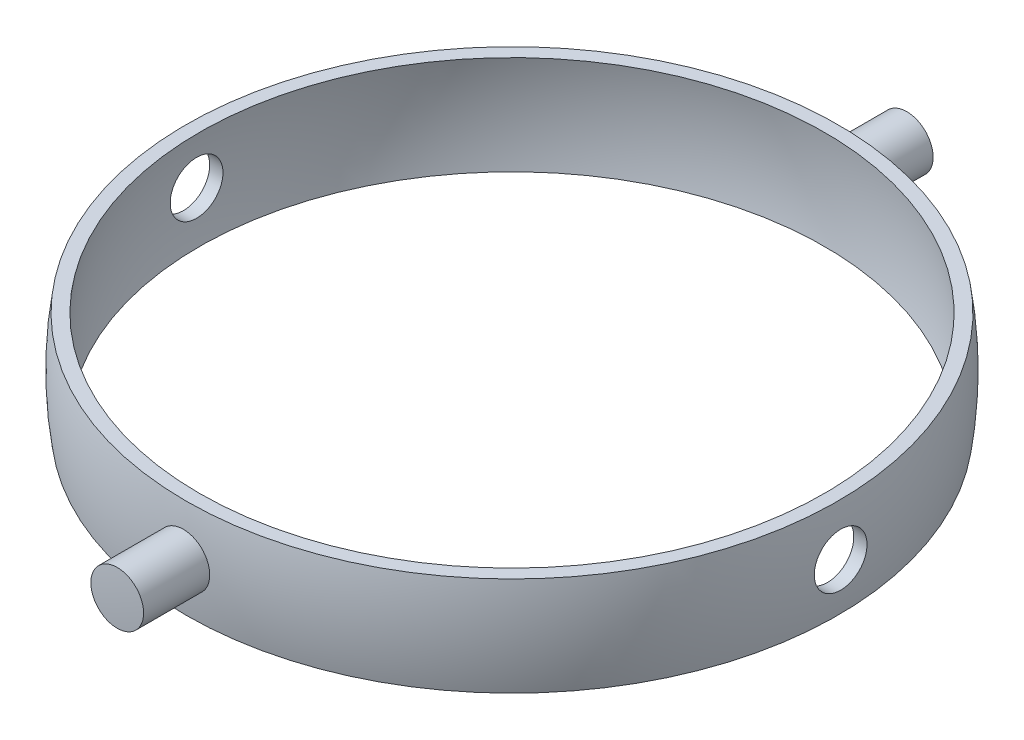
ISO-10303-21;
HEADER;
FILE_DESCRIPTION(('STEP AP214'),'2;1');
FILE_NAME('part.step','',(''),(''),'','','');
FILE_SCHEMA(('AUTOMOTIVE_DESIGN { 1 0 10303 214 1 1 1 1 }'));
ENDSEC;
DATA;
#1=APPLICATION_CONTEXT('core data for automotive mechanical design processes');
#2=APPLICATION_PROTOCOL_DEFINITION('international standard','automotive_design',2000,#1);
#3=PRODUCT_CONTEXT('',#1,'mechanical');
#4=PRODUCT('Part','Part','',(#3));
#5=PRODUCT_RELATED_PRODUCT_CATEGORY('part','',(#4));
#6=PRODUCT_DEFINITION_FORMATION('','',#4);
#7=PRODUCT_DEFINITION_CONTEXT('part definition',#1,'design');
#8=PRODUCT_DEFINITION('design','',#6,#7);
#9=PRODUCT_DEFINITION_SHAPE('','',#8);
#10=(LENGTH_UNIT() NAMED_UNIT(*) SI_UNIT(.MILLI.,.METRE.));
#11=(NAMED_UNIT(*) PLANE_ANGLE_UNIT() SI_UNIT($,.RADIAN.));
#12=(NAMED_UNIT(*) SI_UNIT($,.STERADIAN.) SOLID_ANGLE_UNIT());
#13=UNCERTAINTY_MEASURE_WITH_UNIT(LENGTH_MEASURE(1.E-05),#10,'distance_accuracy_value','');
#14=(GEOMETRIC_REPRESENTATION_CONTEXT(3) GLOBAL_UNCERTAINTY_ASSIGNED_CONTEXT((#13)) GLOBAL_UNIT_ASSIGNED_CONTEXT((#10,
#11,#12)) REPRESENTATION_CONTEXT('',''));
#15=CARTESIAN_POINT('',(0.,0.,0.));
#16=DIRECTION('',(0.,0.,1.));
#17=DIRECTION('',(1.,0.,0.));
#18=AXIS2_PLACEMENT_3D('',#15,#16,#17);
#19=CARTESIAN_POINT('',(0.,0.,0.));
#20=DIRECTION('',(0.,1.,0.));
#21=DIRECTION('',(-1.,0.,0.));
#22=AXIS2_PLACEMENT_3D('',#19,#20,#21);
#23=SPHERICAL_SURFACE('',#22,50.);
#24=CARTESIAN_POINT('',(0.,7.49999999999999,0.));
#25=DIRECTION('',(0.,1.,0.));
#26=DIRECTION('',(0.,0.,1.));
#27=AXIS2_PLACEMENT_3D('',#24,#25,#26);
#28=CIRCLE('',#27,49.434299833213);
#29=CARTESIAN_POINT('',(0.,7.49999999999999,49.434299833213));
#30=VERTEX_POINT('',#29);
#31=EDGE_CURVE('E81',#30,#30,#28,.T.);
#32=ORIENTED_EDGE('',*,*,#31,.F.);
#33=EDGE_LOOP('',(#32));
#34=FACE_BOUND('',#33,.T.);
#35=CARTESIAN_POINT('',(0.,-7.50000000000001,0.));
#36=DIRECTION('',(0.,1.,0.));
#37=DIRECTION('',(0.,0.,1.));
#38=AXIS2_PLACEMENT_3D('',#35,#36,#37);
#39=CIRCLE('',#38,49.434299833213);
#40=CARTESIAN_POINT('',(0.,-7.50000000000001,49.434299833213));
#41=VERTEX_POINT('',#40);
#42=EDGE_CURVE('E47',#41,#41,#39,.T.);
#43=ORIENTED_EDGE('',*,*,#42,.T.);
#44=EDGE_LOOP('',(#43));
#45=FACE_BOUND('',#44,.T.);
#46=CARTESIAN_POINT('',(-49.8397431775085,0.,0.));
#47=DIRECTION('',(1.,0.,0.));
#48=DIRECTION('',(0.,0.,-1.));
#49=AXIS2_PLACEMENT_3D('',#46,#47,#48);
#50=CIRCLE('',#49,4.);
#51=CARTESIAN_POINT('',(-49.8397431775085,0.,-4.));
#52=VERTEX_POINT('',#51);
#53=EDGE_CURVE('E72',#52,#52,#50,.F.);
#54=ORIENTED_EDGE('',*,*,#53,.F.);
#55=EDGE_LOOP('',(#54));
#56=FACE_BOUND('',#55,.T.);
#57=CARTESIAN_POINT('',(49.8397431775085,0.,0.));
#58=DIRECTION('',(-1.,0.,0.));
#59=DIRECTION('',(0.,0.,1.));
#60=AXIS2_PLACEMENT_3D('',#57,#58,#59);
#61=CIRCLE('',#60,4.);
#62=CARTESIAN_POINT('',(49.8397431775085,0.,4.));
#63=VERTEX_POINT('',#62);
#64=EDGE_CURVE('E76',#63,#63,#61,.F.);
#65=ORIENTED_EDGE('',*,*,#64,.F.);
#66=EDGE_LOOP('',(#65));
#67=FACE_BOUND('',#66,.T.);
#68=CARTESIAN_POINT('',(0.,0.,49.8397431775084));
#69=DIRECTION('',(0.,0.,-1.));
#70=DIRECTION('',(-1.,0.,0.));
#71=AXIS2_PLACEMENT_3D('',#68,#69,#70);
#72=CIRCLE('',#71,4.);
#73=CARTESIAN_POINT('',(4.,0.,49.8397431775084));
#74=VERTEX_POINT('',#73);
#75=EDGE_CURVE('E11',#74,#74,#72,.F.);
#76=ORIENTED_EDGE('',*,*,#75,.F.);
#77=EDGE_LOOP('',(#76));
#78=FACE_BOUND('',#77,.T.);
#79=CARTESIAN_POINT('',(0.,0.,-49.8397431775085));
#80=DIRECTION('',(0.,0.,1.));
#81=DIRECTION('',(1.,0.,0.));
#82=AXIS2_PLACEMENT_3D('',#79,#80,#81);
#83=CIRCLE('',#82,4.);
#84=CARTESIAN_POINT('',(4.,0.,-49.8397431775085));
#85=VERTEX_POINT('',#84);
#86=EDGE_CURVE('E63',#85,#85,#83,.F.);
#87=ORIENTED_EDGE('',*,*,#86,.F.);
#88=EDGE_LOOP('',(#87));
#89=FACE_BOUND('',#88,.T.);
#90=ADVANCED_FACE('F38',(#34,#45,#56,#67,#78,#89),#23,.T.);
#91=CARTESIAN_POINT('',(-49.434299833213,-7.5,0.));
#92=DIRECTION('',(0.,-1.,0.));
#93=DIRECTION('',(0.,0.,-1.));
#94=AXIS2_PLACEMENT_3D('',#91,#92,#93);
#95=PLANE('',#94);
#96=CARTESIAN_POINT('',(0.,-7.49999999999999,0.));
#97=DIRECTION('',(0.,1.,0.));
#98=DIRECTION('',(0.,0.,1.));
#99=AXIS2_PLACEMENT_3D('',#96,#97,#98);
#100=CIRCLE('',#99,47.4104418878373);
#101=CARTESIAN_POINT('',(0.,-7.49999999999999,47.4104418878373));
#102=VERTEX_POINT('',#101);
#103=EDGE_CURVE('E89',#102,#102,#100,.T.);
#104=ORIENTED_EDGE('',*,*,#103,.T.);
#105=EDGE_LOOP('',(#104));
#106=FACE_BOUND('',#105,.T.);
#107=ORIENTED_EDGE('',*,*,#42,.F.);
#108=EDGE_LOOP('',(#107));
#109=FACE_BOUND('',#108,.T.);
#110=ADVANCED_FACE('F109',(#106,#109),#95,.T.);
#111=CARTESIAN_POINT('',(0.,0.,0.));
#112=DIRECTION('',(0.,1.,0.));
#113=DIRECTION('',(-1.,0.,0.));
#114=AXIS2_PLACEMENT_3D('',#111,#112,#113);
#115=SPHERICAL_SURFACE('',#114,48.);
#116=CARTESIAN_POINT('',(47.8330429724056,0.,0.));
#117=DIRECTION('',(-1.,0.,0.));
#118=DIRECTION('',(0.,0.,1.));
#119=AXIS2_PLACEMENT_3D('',#116,#117,#118);
#120=CIRCLE('',#119,4.);
#121=CARTESIAN_POINT('',(47.8330429724056,0.,4.));
#122=VERTEX_POINT('',#121);
#123=EDGE_CURVE('E77',#122,#122,#120,.T.);
#124=ORIENTED_EDGE('',*,*,#123,.F.);
#125=EDGE_LOOP('',(#124));
#126=FACE_BOUND('',#125,.T.);
#127=CARTESIAN_POINT('',(-47.8330429724056,0.,0.));
#128=DIRECTION('',(1.,0.,0.));
#129=DIRECTION('',(0.,0.,-1.));
#130=AXIS2_PLACEMENT_3D('',#127,#128,#129);
#131=CIRCLE('',#130,4.);
#132=CARTESIAN_POINT('',(-47.8330429724056,0.,-4.));
#133=VERTEX_POINT('',#132);
#134=EDGE_CURVE('E68',#133,#133,#131,.T.);
#135=ORIENTED_EDGE('',*,*,#134,.F.);
#136=EDGE_LOOP('',(#135));
#137=FACE_BOUND('',#136,.T.);
#138=CARTESIAN_POINT('',(0.,7.49999999999999,0.));
#139=DIRECTION('',(0.,1.,0.));
#140=DIRECTION('',(0.,0.,1.));
#141=AXIS2_PLACEMENT_3D('',#138,#139,#140);
#142=CIRCLE('',#141,47.4104418878373);
#143=CARTESIAN_POINT('',(0.,7.49999999999999,47.4104418878373));
#144=VERTEX_POINT('',#143);
#145=EDGE_CURVE('E85',#144,#144,#142,.T.);
#146=ORIENTED_EDGE('',*,*,#145,.T.);
#147=EDGE_LOOP('',(#146));
#148=FACE_BOUND('',#147,.T.);
#149=ORIENTED_EDGE('',*,*,#103,.F.);
#150=EDGE_LOOP('',(#149));
#151=FACE_BOUND('',#150,.T.);
#152=ADVANCED_FACE('F105',(#126,#137,#148,#151),#115,.F.);
#153=CARTESIAN_POINT('',(-49.434299833213,7.49999999999999,0.));
#154=DIRECTION('',(0.,1.,0.));
#155=DIRECTION('',(0.,0.,1.));
#156=AXIS2_PLACEMENT_3D('',#153,#154,#155);
#157=PLANE('',#156);
#158=ORIENTED_EDGE('',*,*,#31,.T.);
#159=EDGE_LOOP('',(#158));
#160=FACE_BOUND('',#159,.T.);
#161=ORIENTED_EDGE('',*,*,#145,.F.);
#162=EDGE_LOOP('',(#161));
#163=FACE_BOUND('',#162,.T.);
#164=ADVANCED_FACE('F108',(#160,#163),#157,.T.);
#165=CARTESIAN_POINT('',(-50.,0.,0.));
#166=DIRECTION('',(1.,0.,0.));
#167=DIRECTION('',(0.,0.,-1.));
#168=AXIS2_PLACEMENT_3D('',#165,#166,#167);
#169=CYLINDRICAL_SURFACE('',#168,4.);
#170=ORIENTED_EDGE('',*,*,#53,.T.);
#171=EDGE_LOOP('',(#170));
#172=FACE_BOUND('',#171,.T.);
#173=ORIENTED_EDGE('',*,*,#134,.T.);
#174=EDGE_LOOP('',(#173));
#175=FACE_BOUND('',#174,.T.);
#176=ADVANCED_FACE('F143',(#172,#175),#169,.F.);
#177=ORIENTED_EDGE('',*,*,#64,.T.);
#178=EDGE_LOOP('',(#177));
#179=FACE_BOUND('',#178,.T.);
#180=ORIENTED_EDGE('',*,*,#123,.T.);
#181=EDGE_LOOP('',(#180));
#182=FACE_BOUND('',#181,.T.);
#183=ADVANCED_FACE('F103',(#179,#182),#169,.F.);
#184=CARTESIAN_POINT('',(0.,0.,-50.001));
#185=DIRECTION('',(0.,0.,1.));
#186=DIRECTION('',(1.,0.,0.));
#187=AXIS2_PLACEMENT_3D('',#184,#185,#186);
#188=CYLINDRICAL_SURFACE('',#187,4.);
#189=CARTESIAN_POINT('',(0.,0.,59.866518188383));
#190=DIRECTION('',(0.,0.,-1.));
#191=DIRECTION('',(-1.,0.,0.));
#192=AXIS2_PLACEMENT_3D('',#189,#190,#191);
#193=CIRCLE('',#192,4.);
#194=CARTESIAN_POINT('',(4.,0.,59.866518188383));
#195=VERTEX_POINT('',#194);
#196=EDGE_CURVE('E60',#195,#195,#193,.F.);
#197=CARTESIAN_POINT('',(4.,0.,59.866518188383));
#198=CARTESIAN_POINT('',(4.,0.,59.7620726153531));
#199=CARTESIAN_POINT('',(4.,0.,59.6576270423232));
#200=CARTESIAN_POINT('',(4.,0.,59.4487358962633));
#201=CARTESIAN_POINT('',(4.,0.,59.3442903232333));
#202=CARTESIAN_POINT('',(4.,0.,59.1353991771734));
#203=CARTESIAN_POINT('',(4.,0.,59.0309536041435));
#204=CARTESIAN_POINT('',(4.,0.,58.8220624580836));
#205=CARTESIAN_POINT('',(4.,0.,58.7176168850537));
#206=CARTESIAN_POINT('',(4.,0.,58.5087257389938));
#207=CARTESIAN_POINT('',(4.,0.,58.4042801659638));
#208=CARTESIAN_POINT('',(4.,0.,58.1953890199039));
#209=CARTESIAN_POINT('',(4.,0.,58.090943446874));
#210=CARTESIAN_POINT('',(4.,0.,57.8820523008141));
#211=CARTESIAN_POINT('',(4.,0.,57.7776067277842));
#212=CARTESIAN_POINT('',(4.,0.,57.5687155817243));
#213=CARTESIAN_POINT('',(4.,0.,57.4642700086943));
#214=CARTESIAN_POINT('',(4.,0.,57.2553788626345));
#215=CARTESIAN_POINT('',(4.,0.,57.1509332896045));
#216=CARTESIAN_POINT('',(4.,0.,56.9420421435446));
#217=CARTESIAN_POINT('',(4.,0.,56.8375965705147));
#218=CARTESIAN_POINT('',(4.,0.,56.6287054244548));
#219=CARTESIAN_POINT('',(4.,0.,56.5242598514248));
#220=CARTESIAN_POINT('',(4.,0.,56.315368705365));
#221=CARTESIAN_POINT('',(4.,0.,56.210923132335));
#222=CARTESIAN_POINT('',(4.,0.,56.0020319862751));
#223=CARTESIAN_POINT('',(4.,0.,55.8975864132452));
#224=CARTESIAN_POINT('',(4.,0.,55.6886952671853));
#225=CARTESIAN_POINT('',(4.,0.,55.5842496941554));
#226=CARTESIAN_POINT('',(4.,0.,55.3753585480955));
#227=CARTESIAN_POINT('',(4.,0.,55.2709129750655));
#228=CARTESIAN_POINT('',(4.,0.,55.0620218290056));
#229=CARTESIAN_POINT('',(4.,0.,54.9575762559757));
#230=CARTESIAN_POINT('',(4.,0.,54.7486851099158));
#231=CARTESIAN_POINT('',(4.,0.,54.6442395368859));
#232=CARTESIAN_POINT('',(4.,0.,54.435348390826));
#233=CARTESIAN_POINT('',(4.,0.,54.330902817796));
#234=CARTESIAN_POINT('',(4.,0.,54.1220116717361));
#235=CARTESIAN_POINT('',(4.,0.,54.0175660987062));
#236=CARTESIAN_POINT('',(4.,0.,53.8086749526463));
#237=CARTESIAN_POINT('',(4.,0.,53.7042293796164));
#238=CARTESIAN_POINT('',(4.,0.,53.4953382335565));
#239=CARTESIAN_POINT('',(4.,0.,53.3908926605265));
#240=CARTESIAN_POINT('',(4.,0.,53.1820015144666));
#241=CARTESIAN_POINT('',(4.,0.,53.0775559414367));
#242=CARTESIAN_POINT('',(4.,0.,52.8686647953768));
#243=CARTESIAN_POINT('',(4.,0.,52.7642192223469));
#244=CARTESIAN_POINT('',(4.,0.,52.555328076287));
#245=CARTESIAN_POINT('',(4.,0.,52.450882503257));
#246=CARTESIAN_POINT('',(4.,0.,52.2419913571971));
#247=CARTESIAN_POINT('',(4.,0.,52.1375457841672));
#248=CARTESIAN_POINT('',(4.,0.,51.9286546381073));
#249=CARTESIAN_POINT('',(4.,0.,51.8242090650774));
#250=CARTESIAN_POINT('',(4.,0.,51.6153179190175));
#251=CARTESIAN_POINT('',(4.,0.,51.5108723459875));
#252=CARTESIAN_POINT('',(4.,0.,51.3019811999276));
#253=CARTESIAN_POINT('',(4.,0.,51.1975356268977));
#254=CARTESIAN_POINT('',(4.,0.,50.9886444808378));
#255=CARTESIAN_POINT('',(4.,0.,50.8841989078079));
#256=CARTESIAN_POINT('',(4.,0.,50.675307761748));
#257=CARTESIAN_POINT('',(4.,0.,50.5708621887181));
#258=CARTESIAN_POINT('',(4.,0.,50.3619710426582));
#259=CARTESIAN_POINT('',(4.,0.,50.2575254696282));
#260=CARTESIAN_POINT('',(4.,0.,50.0486343235683));
#261=CARTESIAN_POINT('',(4.,0.,49.9441887505384));
#262=CARTESIAN_POINT('',(4.,0.,49.8397431775084));
#263=B_SPLINE_CURVE_WITH_KNOTS('',3,(#197,#198,#199,#200,#201,#202,#203,#204,#205,#206,#207,
#208,#209,#210,#211,#212,#213,#214,#215,#216,#217,#218,#219,#220,#221,#222,#223,#224,#225,#226,
#227,#228,#229,#230,#231,#232,#233,#234,#235,#236,#237,#238,#239,#240,#241,#242,#243,#244,#245,
#246,#247,#248,#249,#250,#251,#252,#253,#254,#255,#256,#257,#258,#259,#260,#261,#262),
.UNSPECIFIED.,.F.,.F.,(4,2,2,2,2,2,2,2,2,2,2,2,2,2,2,2,2,2,2,2,2,2,2,2,2,2,2,2,2,2,2,2,4),(0.,
0.313336719089827,0.626673438179667,0.940010157269494,1.25334687635932,1.56668359544916,
1.88002031453899,2.19335703362882,2.50669375271864,2.82003047180848,3.13336719089831,
3.44670390998814,3.76004062907798,4.0733773481678,4.38671406725763,4.70005078634747,
5.0133875054373,5.32672422452712,5.64006094361696,5.95339766270679,6.26673438179662,
6.58007110088646,6.89340781997629,7.20674453906611,7.52008125815595,7.83341797724578,
8.14675469633561,8.46009141542545,8.77342813451527,9.0867648536051,9.40010157269493,
9.71343829178477,10.0267750108746),.UNSPECIFIED.);
#264=EDGE_CURVE('BSEAM134',#195,#74,#263,.T.);
#265=ORIENTED_EDGE('',*,*,#196,.F.);
#266=ORIENTED_EDGE('',*,*,#75,.T.);
#267=ORIENTED_EDGE('',*,*,#264,.T.);
#268=ORIENTED_EDGE('',*,*,#264,.F.);
#269=EDGE_LOOP('',(#265,#267,#266,#268));
#270=FACE_BOUND('',#269,.T.);
#271=ADVANCED_FACE('F134',(#270),#188,.T.);
#272=CARTESIAN_POINT('',(0.,0.,60.001));
#273=DIRECTION('',(0.,0.,-1.));
#274=DIRECTION('',(-1.,0.,0.));
#275=AXIS2_PLACEMENT_3D('',#272,#273,#274);
#276=CYLINDRICAL_SURFACE('',#275,4.);
#277=CARTESIAN_POINT('',(0.,0.,-59.8665181883831));
#278=DIRECTION('',(0.,0.,1.));
#279=DIRECTION('',(1.,0.,0.));
#280=AXIS2_PLACEMENT_3D('',#277,#278,#279);
#281=CIRCLE('',#280,4.);
#282=CARTESIAN_POINT('',(4.,0.,-59.8665181883831));
#283=VERTEX_POINT('',#282);
#284=EDGE_CURVE('E41',#283,#283,#281,.T.);
#285=ORIENTED_EDGE('',*,*,#284,.T.);
#286=EDGE_LOOP('',(#285));
#287=FACE_BOUND('',#286,.T.);
#288=ORIENTED_EDGE('',*,*,#86,.T.);
#289=EDGE_LOOP('',(#288));
#290=FACE_BOUND('',#289,.T.);
#291=ADVANCED_FACE('F132',(#287,#290),#276,.T.);
#292=CARTESIAN_POINT('',(0.,0.,0.));
#293=DIRECTION('',(0.,1.,0.));
#294=DIRECTION('',(0.,0.,1.));
#295=AXIS2_PLACEMENT_3D('',#292,#293,#294);
#296=SPHERICAL_SURFACE('',#295,60.);
#297=CARTESIAN_POINT('',(0.,0.,-60.));
#298=VERTEX_POINT('',#297);
#299=VERTEX_LOOP('',#298);
#300=FACE_BOUND('',#299,.T.);
#301=ORIENTED_EDGE('',*,*,#284,.F.);
#302=EDGE_LOOP('',(#301));
#303=FACE_BOUND('',#302,.T.);
#304=ADVANCED_FACE('F56',(#300,#303),#296,.T.);
#305=CARTESIAN_POINT('',(0.,0.,60.));
#306=VERTEX_POINT('',#305);
#307=VERTEX_LOOP('',#306);
#308=FACE_BOUND('',#307,.T.);
#309=ORIENTED_EDGE('',*,*,#196,.T.);
#310=EDGE_LOOP('',(#309));
#311=FACE_BOUND('',#310,.T.);
#312=ADVANCED_FACE('F53',(#308,#311),#296,.T.);
#313=CLOSED_SHELL('',(#90,#110,#152,#164,#176,#183,#271,#291,#304,#312));
#314=MANIFOLD_SOLID_BREP('B2',#313);
#315=ADVANCED_BREP_SHAPE_REPRESENTATION('',(#18,#314),#14);
#316=SHAPE_DEFINITION_REPRESENTATION(#9,#315);
ENDSEC;
END-ISO-10303-21;
